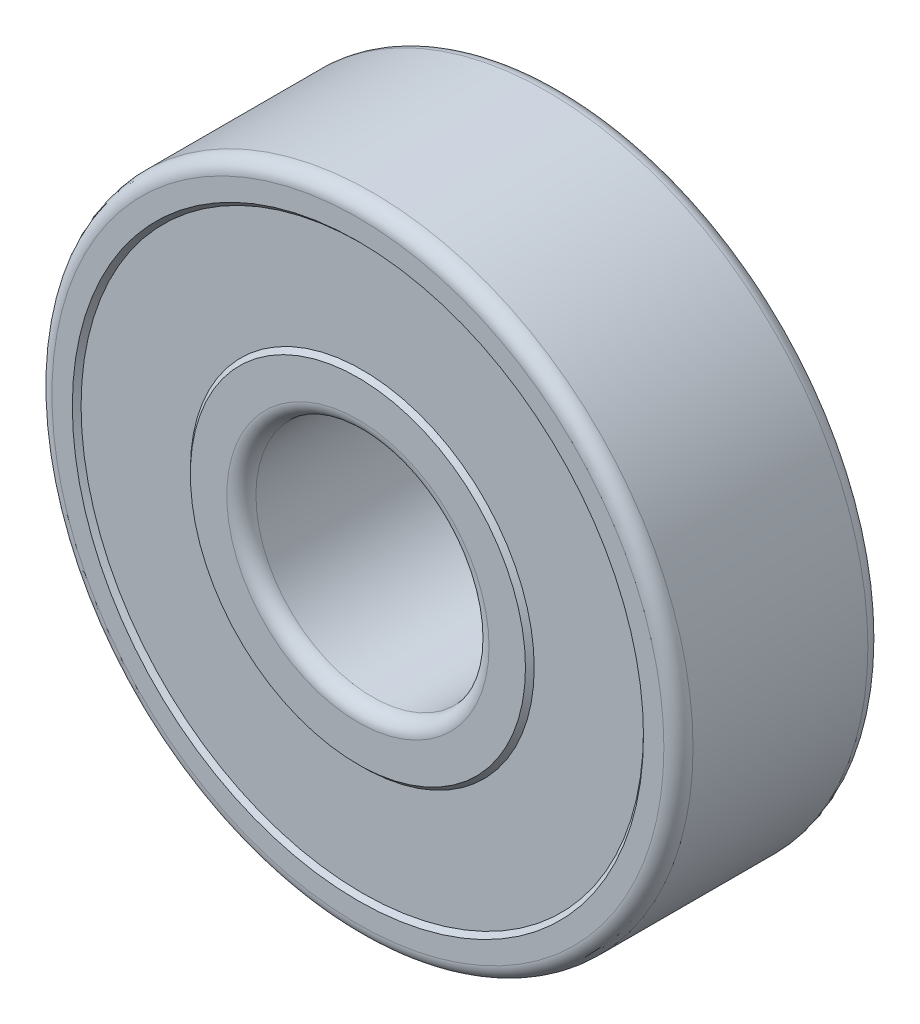
ISO-10303-21;
HEADER;
FILE_DESCRIPTION(('STEP AP214'),'2;1');
FILE_NAME('part.step','',(''),(''),'','','');
FILE_SCHEMA(('AUTOMOTIVE_DESIGN { 1 0 10303 214 1 1 1 1 }'));
ENDSEC;
DATA;
#1=APPLICATION_CONTEXT('core data for automotive mechanical design processes');
#2=APPLICATION_PROTOCOL_DEFINITION('international standard','automotive_design',2000,#1);
#3=PRODUCT_CONTEXT('',#1,'mechanical');
#4=PRODUCT('Part','Part','',(#3));
#5=PRODUCT_RELATED_PRODUCT_CATEGORY('part','',(#4));
#6=PRODUCT_DEFINITION_FORMATION('','',#4);
#7=PRODUCT_DEFINITION_CONTEXT('part definition',#1,'design');
#8=PRODUCT_DEFINITION('design','',#6,#7);
#9=PRODUCT_DEFINITION_SHAPE('','',#8);
#10=(LENGTH_UNIT() NAMED_UNIT(*) SI_UNIT(.MILLI.,.METRE.));
#11=(NAMED_UNIT(*) PLANE_ANGLE_UNIT() SI_UNIT($,.RADIAN.));
#12=(NAMED_UNIT(*) SI_UNIT($,.STERADIAN.) SOLID_ANGLE_UNIT());
#13=UNCERTAINTY_MEASURE_WITH_UNIT(LENGTH_MEASURE(1.E-05),#10,'distance_accuracy_value','');
#14=(GEOMETRIC_REPRESENTATION_CONTEXT(3) GLOBAL_UNCERTAINTY_ASSIGNED_CONTEXT((#13)) GLOBAL_UNIT_ASSIGNED_CONTEXT((#10,
#11,#12)) REPRESENTATION_CONTEXT('',''));
#15=CARTESIAN_POINT('',(0.,0.,0.));
#16=DIRECTION('',(0.,0.,1.));
#17=DIRECTION('',(1.,0.,0.));
#18=AXIS2_PLACEMENT_3D('',#15,#16,#17);
#19=CARTESIAN_POINT('',(0.,0.,-6.85));
#20=DIRECTION('',(0.,0.,1.));
#21=DIRECTION('',(1.,0.,0.));
#22=AXIS2_PLACEMENT_3D('',#19,#20,#21);
#23=CONICAL_SURFACE('',#22,5.9,0.7853981625);
#24=CARTESIAN_POINT('',(0.,0.,-6.85));
#25=DIRECTION('',(0.,0.,1.));
#26=DIRECTION('',(1.,0.,0.));
#27=AXIS2_PLACEMENT_3D('',#24,#25,#26);
#28=CIRCLE('',#27,5.9);
#29=CARTESIAN_POINT('',(5.9,0.,-6.85));
#30=VERTEX_POINT('',#29);
#31=EDGE_CURVE('P0_E80',#30,#30,#28,.T.);
#32=ORIENTED_EDGE('',*,*,#31,.F.);
#33=EDGE_LOOP('',(#32));
#34=FACE_BOUND('',#33,.T.);
#35=CARTESIAN_POINT('',(0.,0.,-7.));
#36=DIRECTION('',(0.,0.,-1.));
#37=DIRECTION('',(1.,0.,0.));
#38=AXIS2_PLACEMENT_3D('',#35,#36,#37);
#39=CIRCLE('',#38,5.75);
#40=CARTESIAN_POINT('',(5.75,0.,-7.));
#41=VERTEX_POINT('',#40);
#42=EDGE_CURVE('P0_E68',#41,#41,#39,.T.);
#43=ORIENTED_EDGE('',*,*,#42,.F.);
#44=EDGE_LOOP('',(#43));
#45=FACE_BOUND('',#44,.T.);
#46=ADVANCED_FACE('P0_F16',(#34,#45),#23,.T.);
#47=CARTESIAN_POINT('',(0.,0.,0.));
#48=DIRECTION('',(0.,0.,-1.));
#49=DIRECTION('',(-1.,0.,0.));
#50=AXIS2_PLACEMENT_3D('',#47,#48,#49);
#51=CONICAL_SURFACE('',#50,5.75,0.7853981625);
#52=CARTESIAN_POINT('',(0.,0.,0.));
#53=DIRECTION('',(0.,0.,1.));
#54=DIRECTION('',(1.,0.,0.));
#55=AXIS2_PLACEMENT_3D('',#52,#53,#54);
#56=CIRCLE('',#55,5.75);
#57=CARTESIAN_POINT('',(5.75,0.,0.));
#58=VERTEX_POINT('',#57);
#59=EDGE_CURVE('P0_E27',#58,#58,#56,.T.);
#60=ORIENTED_EDGE('',*,*,#59,.F.);
#61=EDGE_LOOP('',(#60));
#62=FACE_BOUND('',#61,.T.);
#63=CARTESIAN_POINT('',(0.,0.,-0.15));
#64=DIRECTION('',(0.,0.,-1.));
#65=DIRECTION('',(1.,0.,0.));
#66=AXIS2_PLACEMENT_3D('',#63,#64,#65);
#67=CIRCLE('',#66,5.9);
#68=CARTESIAN_POINT('',(5.9,0.,-0.15));
#69=VERTEX_POINT('',#68);
#70=EDGE_CURVE('P0_E89',#69,#69,#67,.T.);
#71=ORIENTED_EDGE('',*,*,#70,.F.);
#72=EDGE_LOOP('',(#71));
#73=FACE_BOUND('',#72,.T.);
#74=ADVANCED_FACE('P0_F113',(#62,#73),#51,.T.);
#75=CARTESIAN_POINT('',(0.,0.,-6.5));
#76=DIRECTION('',(0.,0.,1.));
#77=DIRECTION('',(1.,0.,0.));
#78=AXIS2_PLACEMENT_3D('',#75,#76,#77);
#79=TOROIDAL_SURFACE('',#78,4.5,0.5);
#80=CARTESIAN_POINT('',(0.,0.,-7.));
#81=DIRECTION('',(0.,0.,1.));
#82=DIRECTION('',(1.,0.,0.));
#83=AXIS2_PLACEMENT_3D('',#80,#81,#82);
#84=CIRCLE('',#83,4.5);
#85=CARTESIAN_POINT('',(4.5,0.,-7.));
#86=VERTEX_POINT('',#85);
#87=EDGE_CURVE('P0_E63',#86,#86,#84,.T.);
#88=ORIENTED_EDGE('',*,*,#87,.F.);
#89=EDGE_LOOP('',(#88));
#90=FACE_BOUND('',#89,.T.);
#91=CARTESIAN_POINT('',(0.,0.,-6.5));
#92=DIRECTION('',(0.,0.,-1.));
#93=DIRECTION('',(1.,0.,0.));
#94=AXIS2_PLACEMENT_3D('',#91,#92,#93);
#95=CIRCLE('',#94,4.);
#96=CARTESIAN_POINT('',(4.,0.,-6.5));
#97=VERTEX_POINT('',#96);
#98=EDGE_CURVE('P0_E75',#97,#97,#95,.T.);
#99=ORIENTED_EDGE('',*,*,#98,.F.);
#100=EDGE_LOOP('',(#99));
#101=FACE_BOUND('',#100,.T.);
#102=ADVANCED_FACE('P0_F110',(#90,#101),#79,.T.);
#103=CARTESIAN_POINT('',(0.,0.,-0.5));
#104=DIRECTION('',(0.,0.,1.));
#105=DIRECTION('',(1.,0.,0.));
#106=AXIS2_PLACEMENT_3D('',#103,#104,#105);
#107=TOROIDAL_SURFACE('',#106,4.5,0.5);
#108=CARTESIAN_POINT('',(0.,0.,-0.5));
#109=DIRECTION('',(0.,0.,1.));
#110=DIRECTION('',(1.,0.,0.));
#111=AXIS2_PLACEMENT_3D('',#108,#109,#110);
#112=CIRCLE('',#111,4.);
#113=CARTESIAN_POINT('',(4.,0.,-0.5));
#114=VERTEX_POINT('',#113);
#115=EDGE_CURVE('P0_E87',#114,#114,#112,.T.);
#116=ORIENTED_EDGE('',*,*,#115,.F.);
#117=EDGE_LOOP('',(#116));
#118=FACE_BOUND('',#117,.T.);
#119=CARTESIAN_POINT('',(0.,0.,0.));
#120=DIRECTION('',(0.,0.,-1.));
#121=DIRECTION('',(1.,0.,0.));
#122=AXIS2_PLACEMENT_3D('',#119,#120,#121);
#123=CIRCLE('',#122,4.5);
#124=CARTESIAN_POINT('',(4.5,0.,0.));
#125=VERTEX_POINT('',#124);
#126=EDGE_CURVE('P0_E10',#125,#125,#123,.T.);
#127=ORIENTED_EDGE('',*,*,#126,.F.);
#128=EDGE_LOOP('',(#127));
#129=FACE_BOUND('',#128,.T.);
#130=ADVANCED_FACE('P0_F112',(#118,#129),#107,.T.);
#131=CARTESIAN_POINT('',(0.,0.,-3.5));
#132=DIRECTION('',(0.,0.,1.));
#133=DIRECTION('',(1.,0.,0.));
#134=AXIS2_PLACEMENT_3D('',#131,#132,#133);
#135=TOROIDAL_SURFACE('',#134,7.5,2.);
#136=CARTESIAN_POINT('',(0.,0.,-4.7));
#137=DIRECTION('',(0.,0.,1.));
#138=DIRECTION('',(1.,0.,0.));
#139=AXIS2_PLACEMENT_3D('',#136,#137,#138);
#140=CIRCLE('',#139,5.9);
#141=CARTESIAN_POINT('',(5.9,0.,-4.7));
#142=VERTEX_POINT('',#141);
#143=EDGE_CURVE('P0_E78',#142,#142,#140,.T.);
#144=ORIENTED_EDGE('',*,*,#143,.T.);
#145=EDGE_LOOP('',(#144));
#146=FACE_BOUND('',#145,.T.);
#147=CARTESIAN_POINT('',(0.,0.,-2.3));
#148=DIRECTION('',(0.,0.,-1.));
#149=DIRECTION('',(-1.,0.,0.));
#150=AXIS2_PLACEMENT_3D('',#147,#148,#149);
#151=CIRCLE('',#150,5.9);
#152=CARTESIAN_POINT('',(-5.9,0.,-2.3));
#153=VERTEX_POINT('',#152);
#154=EDGE_CURVE('P0_E20',#153,#153,#151,.T.);
#155=ORIENTED_EDGE('',*,*,#154,.T.);
#156=EDGE_LOOP('',(#155));
#157=FACE_BOUND('',#156,.T.);
#158=ADVANCED_FACE('P0_F120',(#146,#157),#135,.F.);
#159=CARTESIAN_POINT('',(0.,0.,0.));
#160=DIRECTION('',(0.,0.,1.));
#161=DIRECTION('',(1.,0.,0.));
#162=AXIS2_PLACEMENT_3D('',#159,#160,#161);
#163=PLANE('',#162);
#164=ORIENTED_EDGE('',*,*,#126,.T.);
#165=EDGE_LOOP('',(#164));
#166=FACE_BOUND('',#165,.T.);
#167=ORIENTED_EDGE('',*,*,#59,.T.);
#168=EDGE_LOOP('',(#167));
#169=FACE_BOUND('',#168,.T.);
#170=ADVANCED_FACE('P0_F134',(#166,#169),#163,.T.);
#171=CARTESIAN_POINT('',(0.,0.,-7.));
#172=DIRECTION('',(0.,0.,1.));
#173=DIRECTION('',(1.,0.,0.));
#174=AXIS2_PLACEMENT_3D('',#171,#172,#173);
#175=PLANE('',#174);
#176=ORIENTED_EDGE('',*,*,#87,.T.);
#177=EDGE_LOOP('',(#176));
#178=FACE_BOUND('',#177,.T.);
#179=ORIENTED_EDGE('',*,*,#42,.T.);
#180=EDGE_LOOP('',(#179));
#181=FACE_BOUND('',#180,.T.);
#182=ADVANCED_FACE('P0_F64',(#178,#181),#175,.F.);
#183=CARTESIAN_POINT('',(0.,0.,-7.));
#184=DIRECTION('',(0.,0.,1.));
#185=DIRECTION('',(1.,0.,0.));
#186=AXIS2_PLACEMENT_3D('',#183,#184,#185);
#187=CYLINDRICAL_SURFACE('',#186,4.);
#188=ORIENTED_EDGE('',*,*,#98,.T.);
#189=EDGE_LOOP('',(#188));
#190=FACE_BOUND('',#189,.T.);
#191=ORIENTED_EDGE('',*,*,#115,.T.);
#192=EDGE_LOOP('',(#191));
#193=FACE_BOUND('',#192,.T.);
#194=ADVANCED_FACE('P0_F18',(#190,#193),#187,.F.);
#195=CARTESIAN_POINT('',(0.,0.,-7.));
#196=DIRECTION('',(0.,0.,1.));
#197=DIRECTION('',(1.,0.,0.));
#198=AXIS2_PLACEMENT_3D('',#195,#196,#197);
#199=CYLINDRICAL_SURFACE('',#198,5.9);
#200=ORIENTED_EDGE('',*,*,#143,.F.);
#201=EDGE_LOOP('',(#200));
#202=FACE_BOUND('',#201,.T.);
#203=ORIENTED_EDGE('',*,*,#31,.T.);
#204=EDGE_LOOP('',(#203));
#205=FACE_BOUND('',#204,.T.);
#206=ADVANCED_FACE('P0_F141',(#202,#205),#199,.T.);
#207=CARTESIAN_POINT('',(0.,0.,-7.));
#208=DIRECTION('',(0.,0.,1.));
#209=DIRECTION('',(1.,0.,0.));
#210=AXIS2_PLACEMENT_3D('',#207,#208,#209);
#211=CYLINDRICAL_SURFACE('',#210,5.9);
#212=ORIENTED_EDGE('',*,*,#154,.F.);
#213=EDGE_LOOP('',(#212));
#214=FACE_BOUND('',#213,.T.);
#215=ORIENTED_EDGE('',*,*,#70,.T.);
#216=EDGE_LOOP('',(#215));
#217=FACE_BOUND('',#216,.T.);
#218=ADVANCED_FACE('P0_F138',(#214,#217),#211,.T.);
#219=CLOSED_SHELL('',(#46,#74,#102,#130,#158,#170,#182,#194,#206,#218));
#220=MANIFOLD_SOLID_BREP('P0_B1',#219);
#221=CARTESIAN_POINT('',(0.,0.,-0.15));
#222=DIRECTION('',(0.,0.,1.));
#223=DIRECTION('',(1.,0.,0.));
#224=AXIS2_PLACEMENT_3D('',#221,#222,#223);
#225=CONICAL_SURFACE('',#224,9.65,0.785398162499996);
#226=CARTESIAN_POINT('',(0.,0.,-0.15));
#227=DIRECTION('',(0.,0.,1.));
#228=DIRECTION('',(1.,0.,0.));
#229=AXIS2_PLACEMENT_3D('',#226,#227,#228);
#230=CIRCLE('',#229,9.65);
#231=CARTESIAN_POINT('',(9.65,0.,-0.15));
#232=VERTEX_POINT('',#231);
#233=EDGE_CURVE('P1_E21',#232,#232,#230,.T.);
#234=ORIENTED_EDGE('',*,*,#233,.F.);
#235=EDGE_LOOP('',(#234));
#236=FACE_BOUND('',#235,.T.);
#237=CARTESIAN_POINT('',(0.,0.,0.));
#238=DIRECTION('',(0.,0.,-1.));
#239=DIRECTION('',(1.,0.,0.));
#240=AXIS2_PLACEMENT_3D('',#237,#238,#239);
#241=CIRCLE('',#240,9.8);
#242=CARTESIAN_POINT('',(9.8,0.,0.));
#243=VERTEX_POINT('',#242);
#244=EDGE_CURVE('P1_E83',#243,#243,#241,.T.);
#245=ORIENTED_EDGE('',*,*,#244,.F.);
#246=EDGE_LOOP('',(#245));
#247=FACE_BOUND('',#246,.T.);
#248=ADVANCED_FACE('P1_F17',(#236,#247),#225,.F.);
#249=CARTESIAN_POINT('',(0.,0.,-7.));
#250=DIRECTION('',(0.,0.,-1.));
#251=DIRECTION('',(-1.,0.,0.));
#252=AXIS2_PLACEMENT_3D('',#249,#250,#251);
#253=CONICAL_SURFACE('',#252,9.8,0.785398162500003);
#254=CARTESIAN_POINT('',(0.,0.,-7.));
#255=DIRECTION('',(0.,0.,1.));
#256=DIRECTION('',(1.,0.,0.));
#257=AXIS2_PLACEMENT_3D('',#254,#255,#256);
#258=CIRCLE('',#257,9.8);
#259=CARTESIAN_POINT('',(9.8,0.,-7.));
#260=VERTEX_POINT('',#259);
#261=EDGE_CURVE('P1_E77',#260,#260,#258,.T.);
#262=ORIENTED_EDGE('',*,*,#261,.F.);
#263=EDGE_LOOP('',(#262));
#264=FACE_BOUND('',#263,.T.);
#265=CARTESIAN_POINT('',(0.,0.,-6.85));
#266=DIRECTION('',(0.,0.,-1.));
#267=DIRECTION('',(1.,0.,0.));
#268=AXIS2_PLACEMENT_3D('',#265,#266,#267);
#269=CIRCLE('',#268,9.65);
#270=CARTESIAN_POINT('',(9.65,0.,-6.85));
#271=VERTEX_POINT('',#270);
#272=EDGE_CURVE('P1_E100',#271,#271,#269,.T.);
#273=ORIENTED_EDGE('',*,*,#272,.F.);
#274=EDGE_LOOP('',(#273));
#275=FACE_BOUND('',#274,.T.);
#276=ADVANCED_FACE('P1_F133',(#264,#275),#253,.F.);
#277=CARTESIAN_POINT('',(0.,0.,-1.));
#278=DIRECTION('',(0.,0.,1.));
#279=DIRECTION('',(1.,0.,0.));
#280=AXIS2_PLACEMENT_3D('',#277,#278,#279);
#281=PLANE('',#280);
#282=CARTESIAN_POINT('',(0.,0.,-1.));
#283=DIRECTION('',(0.,0.,1.));
#284=DIRECTION('',(1.,0.,0.));
#285=AXIS2_PLACEMENT_3D('',#282,#283,#284);
#286=CIRCLE('',#285,9.1);
#287=CARTESIAN_POINT('',(9.1,0.,-1.));
#288=VERTEX_POINT('',#287);
#289=EDGE_CURVE('P1_E68',#288,#288,#286,.T.);
#290=ORIENTED_EDGE('',*,*,#289,.F.);
#291=EDGE_LOOP('',(#290));
#292=FACE_BOUND('',#291,.T.);
#293=CARTESIAN_POINT('',(0.,0.,-1.));
#294=DIRECTION('',(0.,0.,-1.));
#295=DIRECTION('',(1.,0.,0.));
#296=AXIS2_PLACEMENT_3D('',#293,#294,#295);
#297=CIRCLE('',#296,9.65);
#298=CARTESIAN_POINT('',(9.65,0.,-1.));
#299=VERTEX_POINT('',#298);
#300=EDGE_CURVE('P1_E11',#299,#299,#297,.T.);
#301=ORIENTED_EDGE('',*,*,#300,.F.);
#302=EDGE_LOOP('',(#301));
#303=FACE_BOUND('',#302,.T.);
#304=ADVANCED_FACE('P1_F136',(#292,#303),#281,.T.);
#305=CARTESIAN_POINT('',(0.,0.,-1.));
#306=DIRECTION('',(0.,0.,1.));
#307=DIRECTION('',(1.,0.,0.));
#308=AXIS2_PLACEMENT_3D('',#305,#306,#307);
#309=CYLINDRICAL_SURFACE('',#308,9.65);
#310=ORIENTED_EDGE('',*,*,#300,.T.);
#311=EDGE_LOOP('',(#310));
#312=FACE_BOUND('',#311,.T.);
#313=ORIENTED_EDGE('',*,*,#233,.T.);
#314=EDGE_LOOP('',(#313));
#315=FACE_BOUND('',#314,.T.);
#316=ADVANCED_FACE('P1_F150',(#312,#315),#309,.F.);
#317=CARTESIAN_POINT('',(0.,0.,-6.));
#318=DIRECTION('',(0.,0.,1.));
#319=DIRECTION('',(1.,0.,0.));
#320=AXIS2_PLACEMENT_3D('',#317,#318,#319);
#321=PLANE('',#320);
#322=CARTESIAN_POINT('',(0.,0.,-6.));
#323=DIRECTION('',(0.,0.,1.));
#324=DIRECTION('',(1.,0.,0.));
#325=AXIS2_PLACEMENT_3D('',#322,#323,#324);
#326=CIRCLE('',#325,9.1);
#327=CARTESIAN_POINT('',(9.1,0.,-6.));
#328=VERTEX_POINT('',#327);
#329=EDGE_CURVE('P1_E92',#328,#328,#326,.T.);
#330=ORIENTED_EDGE('',*,*,#329,.T.);
#331=EDGE_LOOP('',(#330));
#332=FACE_BOUND('',#331,.T.);
#333=CARTESIAN_POINT('',(0.,0.,-6.));
#334=DIRECTION('',(0.,0.,-1.));
#335=DIRECTION('',(1.,0.,0.));
#336=AXIS2_PLACEMENT_3D('',#333,#334,#335);
#337=CIRCLE('',#336,9.65);
#338=CARTESIAN_POINT('',(9.65,0.,-6.));
#339=VERTEX_POINT('',#338);
#340=EDGE_CURVE('P1_E96',#339,#339,#337,.T.);
#341=ORIENTED_EDGE('',*,*,#340,.T.);
#342=EDGE_LOOP('',(#341));
#343=FACE_BOUND('',#342,.T.);
#344=ADVANCED_FACE('P1_F144',(#332,#343),#321,.F.);
#345=CARTESIAN_POINT('',(0.,0.,-6.));
#346=DIRECTION('',(0.,0.,-1.));
#347=DIRECTION('',(-1.,0.,0.));
#348=AXIS2_PLACEMENT_3D('',#345,#346,#347);
#349=CYLINDRICAL_SURFACE('',#348,9.65);
#350=ORIENTED_EDGE('',*,*,#340,.F.);
#351=EDGE_LOOP('',(#350));
#352=FACE_BOUND('',#351,.T.);
#353=ORIENTED_EDGE('',*,*,#272,.T.);
#354=EDGE_LOOP('',(#353));
#355=FACE_BOUND('',#354,.T.);
#356=ADVANCED_FACE('P1_F19',(#352,#355),#349,.F.);
#357=CARTESIAN_POINT('',(0.,0.,-6.5));
#358=DIRECTION('',(0.,0.,1.));
#359=DIRECTION('',(1.,0.,0.));
#360=AXIS2_PLACEMENT_3D('',#357,#358,#359);
#361=TOROIDAL_SURFACE('',#360,10.5,0.5);
#362=CARTESIAN_POINT('',(0.,0.,-6.5));
#363=DIRECTION('',(0.,0.,1.));
#364=DIRECTION('',(1.,0.,0.));
#365=AXIS2_PLACEMENT_3D('',#362,#363,#364);
#366=CIRCLE('',#365,11.);
#367=CARTESIAN_POINT('',(11.,0.,-6.5));
#368=VERTEX_POINT('',#367);
#369=EDGE_CURVE('P1_E80',#368,#368,#366,.T.);
#370=ORIENTED_EDGE('',*,*,#369,.F.);
#371=EDGE_LOOP('',(#370));
#372=FACE_BOUND('',#371,.T.);
#373=CARTESIAN_POINT('',(0.,0.,-7.));
#374=DIRECTION('',(0.,0.,-1.));
#375=DIRECTION('',(1.,0.,0.));
#376=AXIS2_PLACEMENT_3D('',#373,#374,#375);
#377=CIRCLE('',#376,10.5);
#378=CARTESIAN_POINT('',(10.5,0.,-7.));
#379=VERTEX_POINT('',#378);
#380=EDGE_CURVE('P1_E86',#379,#379,#377,.T.);
#381=ORIENTED_EDGE('',*,*,#380,.F.);
#382=EDGE_LOOP('',(#381));
#383=FACE_BOUND('',#382,.T.);
#384=ADVANCED_FACE('P1_F118',(#372,#383),#361,.T.);
#385=CARTESIAN_POINT('',(0.,0.,-0.5));
#386=DIRECTION('',(0.,0.,1.));
#387=DIRECTION('',(1.,0.,0.));
#388=AXIS2_PLACEMENT_3D('',#385,#386,#387);
#389=TOROIDAL_SURFACE('',#388,10.5,0.5);
#390=CARTESIAN_POINT('',(0.,0.,0.));
#391=DIRECTION('',(0.,0.,1.));
#392=DIRECTION('',(1.,0.,0.));
#393=AXIS2_PLACEMENT_3D('',#390,#391,#392);
#394=CIRCLE('',#393,10.5);
#395=CARTESIAN_POINT('',(10.5,0.,0.));
#396=VERTEX_POINT('',#395);
#397=EDGE_CURVE('P1_E85',#396,#396,#394,.T.);
#398=ORIENTED_EDGE('',*,*,#397,.F.);
#399=EDGE_LOOP('',(#398));
#400=FACE_BOUND('',#399,.T.);
#401=CARTESIAN_POINT('',(0.,0.,-0.5));
#402=DIRECTION('',(0.,0.,-1.));
#403=DIRECTION('',(1.,0.,0.));
#404=AXIS2_PLACEMENT_3D('',#401,#402,#403);
#405=CIRCLE('',#404,11.);
#406=CARTESIAN_POINT('',(11.,0.,-0.5));
#407=VERTEX_POINT('',#406);
#408=EDGE_CURVE('P1_E72',#407,#407,#405,.T.);
#409=ORIENTED_EDGE('',*,*,#408,.F.);
#410=EDGE_LOOP('',(#409));
#411=FACE_BOUND('',#410,.T.);
#412=ADVANCED_FACE('P1_F121',(#400,#411),#389,.T.);
#413=CARTESIAN_POINT('',(0.,0.,-3.5));
#414=DIRECTION('',(0.,0.,-1.));
#415=DIRECTION('',(-1.,0.,0.));
#416=AXIS2_PLACEMENT_3D('',#413,#414,#415);
#417=TOROIDAL_SURFACE('',#416,7.5,2.);
#418=CARTESIAN_POINT('',(0.,0.,-4.7));
#419=DIRECTION('',(0.,0.,1.));
#420=DIRECTION('',(1.,0.,0.));
#421=AXIS2_PLACEMENT_3D('',#418,#419,#420);
#422=CIRCLE('',#421,9.1);
#423=CARTESIAN_POINT('',(9.1,0.,-4.7));
#424=VERTEX_POINT('',#423);
#425=EDGE_CURVE('P1_E88',#424,#424,#422,.T.);
#426=ORIENTED_EDGE('',*,*,#425,.F.);
#427=EDGE_LOOP('',(#426));
#428=FACE_BOUND('',#427,.T.);
#429=CARTESIAN_POINT('',(0.,0.,-2.3));
#430=DIRECTION('',(0.,0.,-1.));
#431=DIRECTION('',(-1.,0.,0.));
#432=AXIS2_PLACEMENT_3D('',#429,#430,#431);
#433=CIRCLE('',#432,9.1);
#434=CARTESIAN_POINT('',(-9.1,0.,-2.3));
#435=VERTEX_POINT('',#434);
#436=EDGE_CURVE('P1_E61',#435,#435,#433,.T.);
#437=ORIENTED_EDGE('',*,*,#436,.F.);
#438=EDGE_LOOP('',(#437));
#439=FACE_BOUND('',#438,.T.);
#440=ADVANCED_FACE('P1_F170',(#428,#439),#417,.F.);
#441=CARTESIAN_POINT('',(0.,0.,0.));
#442=DIRECTION('',(0.,0.,1.));
#443=DIRECTION('',(1.,0.,0.));
#444=AXIS2_PLACEMENT_3D('',#441,#442,#443);
#445=PLANE('',#444);
#446=ORIENTED_EDGE('',*,*,#397,.T.);
#447=EDGE_LOOP('',(#446));
#448=FACE_BOUND('',#447,.T.);
#449=ORIENTED_EDGE('',*,*,#244,.T.);
#450=EDGE_LOOP('',(#449));
#451=FACE_BOUND('',#450,.T.);
#452=ADVANCED_FACE('P1_F129',(#448,#451),#445,.T.);
#453=CARTESIAN_POINT('',(0.,0.,-7.));
#454=DIRECTION('',(0.,0.,1.));
#455=DIRECTION('',(1.,0.,0.));
#456=AXIS2_PLACEMENT_3D('',#453,#454,#455);
#457=PLANE('',#456);
#458=ORIENTED_EDGE('',*,*,#380,.T.);
#459=EDGE_LOOP('',(#458));
#460=FACE_BOUND('',#459,.T.);
#461=ORIENTED_EDGE('',*,*,#261,.T.);
#462=EDGE_LOOP('',(#461));
#463=FACE_BOUND('',#462,.T.);
#464=ADVANCED_FACE('P1_F126',(#460,#463),#457,.F.);
#465=CARTESIAN_POINT('',(0.,0.,-7.));
#466=DIRECTION('',(0.,0.,1.));
#467=DIRECTION('',(1.,0.,0.));
#468=AXIS2_PLACEMENT_3D('',#465,#466,#467);
#469=CYLINDRICAL_SURFACE('',#468,9.1);
#470=ORIENTED_EDGE('',*,*,#436,.T.);
#471=EDGE_LOOP('',(#470));
#472=FACE_BOUND('',#471,.T.);
#473=ORIENTED_EDGE('',*,*,#289,.T.);
#474=EDGE_LOOP('',(#473));
#475=FACE_BOUND('',#474,.T.);
#476=ADVANCED_FACE('P1_F69',(#472,#475),#469,.F.);
#477=CARTESIAN_POINT('',(0.,0.,-7.));
#478=DIRECTION('',(0.,0.,1.));
#479=DIRECTION('',(1.,0.,0.));
#480=AXIS2_PLACEMENT_3D('',#477,#478,#479);
#481=CYLINDRICAL_SURFACE('',#480,11.);
#482=ORIENTED_EDGE('',*,*,#408,.T.);
#483=EDGE_LOOP('',(#482));
#484=FACE_BOUND('',#483,.T.);
#485=ORIENTED_EDGE('',*,*,#369,.T.);
#486=EDGE_LOOP('',(#485));
#487=FACE_BOUND('',#486,.T.);
#488=ADVANCED_FACE('P1_F116',(#484,#487),#481,.T.);
#489=CARTESIAN_POINT('',(0.,0.,-7.));
#490=DIRECTION('',(0.,0.,1.));
#491=DIRECTION('',(1.,0.,0.));
#492=AXIS2_PLACEMENT_3D('',#489,#490,#491);
#493=CYLINDRICAL_SURFACE('',#492,9.1);
#494=ORIENTED_EDGE('',*,*,#329,.F.);
#495=EDGE_LOOP('',(#494));
#496=FACE_BOUND('',#495,.T.);
#497=ORIENTED_EDGE('',*,*,#425,.T.);
#498=EDGE_LOOP('',(#497));
#499=FACE_BOUND('',#498,.T.);
#500=ADVANCED_FACE('P1_F162',(#496,#499),#493,.F.);
#501=CLOSED_SHELL('',(#248,#276,#304,#316,#344,#356,#384,#412,#440,#452,#464,#476,#488,#500));
#502=MANIFOLD_SOLID_BREP('P1_B1',#501);
#503=CARTESIAN_POINT('',(0.,7.5,-3.5));
#504=DIRECTION('',(0.,0.,1.));
#505=DIRECTION('',(1.,0.,0.));
#506=AXIS2_PLACEMENT_3D('',#503,#504,#505);
#507=SPHERICAL_SURFACE('',#506,2.);
#508=CARTESIAN_POINT('',(2.,7.5,-3.5));
#509=VERTEX_POINT('',#508);
#510=VERTEX_LOOP('',#509);
#511=FACE_BOUND('',#510,.T.);
#512=ADVANCED_FACE('P2_F15',(#511),#507,.T.);
#513=CLOSED_SHELL('',(#512));
#514=MANIFOLD_SOLID_BREP('P2_B1',#513);
#515=CARTESIAN_POINT('',(-5.86385270900786,4.67602731034167,-3.5));
#516=DIRECTION('',(0.,0.,1.));
#517=DIRECTION('',(0.623470308045556,0.781847027867715,0.));
#518=AXIS2_PLACEMENT_3D('',#515,#516,#517);
#519=SPHERICAL_SURFACE('',#518,2.);
#520=CARTESIAN_POINT('',(-4.61691209291675,6.2397213660771,-3.5));
#521=VERTEX_POINT('',#520);
#522=VERTEX_LOOP('',#521);
#523=FACE_BOUND('',#522,.T.);
#524=ADVANCED_FACE('P3_F15',(#523),#519,.T.);
#525=CLOSED_SHELL('',(#524));
#526=MANIFOLD_SOLID_BREP('P3_B1',#525);
#527=CARTESIAN_POINT('',(-7.3118761096378,-1.66927162478369,-3.5));
#528=DIRECTION('',(0.,0.,1.));
#529=DIRECTION('',(-0.222569549971159,0.974916814618373,0.));
#530=AXIS2_PLACEMENT_3D('',#527,#528,#529);
#531=SPHERICAL_SURFACE('',#530,2.);
#532=CARTESIAN_POINT('',(-7.75701520958012,0.280562004453052,-3.5));
#533=VERTEX_POINT('',#532);
#534=VERTEX_LOOP('',#533);
#535=FACE_BOUND('',#534,.T.);
#536=ADVANCED_FACE('P4_F15',(#535),#531,.T.);
#537=CLOSED_SHELL('',(#536));
#538=MANIFOLD_SOLID_BREP('P4_B1',#537);
#539=CARTESIAN_POINT('',(-3.25362259192578,-6.75750989857286,-3.5));
#540=DIRECTION('',(0.,0.,1.));
#541=DIRECTION('',(-0.901001319809715,0.433816345590103,0.));
#542=AXIS2_PLACEMENT_3D('',#539,#540,#541);
#543=SPHERICAL_SURFACE('',#542,2.);
#544=CARTESIAN_POINT('',(-5.05562523154521,-5.88987720739265,-3.5));
#545=VERTEX_POINT('',#544);
#546=VERTEX_LOOP('',#545);
#547=FACE_BOUND('',#546,.T.);
#548=ADVANCED_FACE('P5_F15',(#547),#543,.T.);
#549=CLOSED_SHELL('',(#548));
#550=MANIFOLD_SOLID_BREP('P5_B1',#549);
#551=CARTESIAN_POINT('',(3.25480195033391,-6.75694193138453,-3.5));
#552=DIRECTION('',(0.,0.,1.));
#553=DIRECTION('',(-0.900925590851271,-0.433973593377855,0.));
#554=AXIS2_PLACEMENT_3D('',#551,#552,#553);
#555=SPHERICAL_SURFACE('',#554,2.);
#556=CARTESIAN_POINT('',(1.45295076863137,-7.62488911814024,-3.5));
#557=VERTEX_POINT('',#556);
#558=VERTEX_LOOP('',#557);
#559=FACE_BOUND('',#558,.T.);
#560=ADVANCED_FACE('P6_F15',(#559),#555,.T.);
#561=CLOSED_SHELL('',(#560));
#562=MANIFOLD_SOLID_BREP('P6_B1',#561);
#563=CARTESIAN_POINT('',(7.3121673411297,-1.66799543623964,-3.5));
#564=DIRECTION('',(0.,0.,1.));
#565=DIRECTION('',(-0.222399391498618,-0.97495564548396,0.));
#566=AXIS2_PLACEMENT_3D('',#563,#564,#565);
#567=SPHERICAL_SURFACE('',#566,2.);
#568=CARTESIAN_POINT('',(6.86736855813246,-3.61790672720756,-3.5));
#569=VERTEX_POINT('',#568);
#570=VERTEX_LOOP('',#569);
#571=FACE_BOUND('',#570,.T.);
#572=ADVANCED_FACE('P7_F15',(#571),#567,.T.);
#573=CLOSED_SHELL('',(#572));
#574=MANIFOLD_SOLID_BREP('P7_B1',#573);
#575=CARTESIAN_POINT('',(5.86303649897566,4.67705067448272,-3.5));
#576=DIRECTION('',(0.,0.,1.));
#577=DIRECTION('',(0.623606756597696,-0.781738199863421,0.));
#578=AXIS2_PLACEMENT_3D('',#575,#576,#577);
#579=SPHERICAL_SURFACE('',#578,2.);
#580=CARTESIAN_POINT('',(7.11025001217105,3.11357427475588,-3.5));
#581=VERTEX_POINT('',#580);
#582=VERTEX_LOOP('',#581);
#583=FACE_BOUND('',#582,.T.);
#584=ADVANCED_FACE('P8_F15',(#583),#579,.T.);
#585=CLOSED_SHELL('',(#584));
#586=MANIFOLD_SOLID_BREP('P8_B1',#585);
#587=CARTESIAN_POINT('',(0.,0.,-6.85));
#588=DIRECTION('',(0.,0.,1.));
#589=DIRECTION('',(1.,0.,0.));
#590=AXIS2_PLACEMENT_3D('',#587,#588,#589);
#591=PLANE('',#590);
#592=CARTESIAN_POINT('',(0.,0.,-6.85));
#593=DIRECTION('',(0.,0.,1.));
#594=DIRECTION('',(1.,0.,0.));
#595=AXIS2_PLACEMENT_3D('',#592,#593,#594);
#596=CIRCLE('',#595,5.9);
#597=CARTESIAN_POINT('',(5.9,0.,-6.85));
#598=VERTEX_POINT('',#597);
#599=EDGE_CURVE('P9_E11',#598,#598,#596,.T.);
#600=ORIENTED_EDGE('',*,*,#599,.T.);
#601=EDGE_LOOP('',(#600));
#602=FACE_BOUND('',#601,.T.);
#603=CARTESIAN_POINT('',(0.,0.,-6.85));
#604=DIRECTION('',(0.,0.,1.));
#605=DIRECTION('',(1.,0.,0.));
#606=AXIS2_PLACEMENT_3D('',#603,#604,#605);
#607=CIRCLE('',#606,9.65);
#608=CARTESIAN_POINT('',(9.65,0.,-6.85));
#609=VERTEX_POINT('',#608);
#610=EDGE_CURVE('P9_E52',#609,#609,#607,.T.);
#611=ORIENTED_EDGE('',*,*,#610,.F.);
#612=EDGE_LOOP('',(#611));
#613=FACE_BOUND('',#612,.T.);
#614=ADVANCED_FACE('P9_F17',(#602,#613),#591,.F.);
#615=CARTESIAN_POINT('',(0.,0.,-6.));
#616=DIRECTION('',(0.,0.,1.));
#617=DIRECTION('',(1.,0.,0.));
#618=AXIS2_PLACEMENT_3D('',#615,#616,#617);
#619=PLANE('',#618);
#620=CARTESIAN_POINT('',(0.,0.,-6.));
#621=DIRECTION('',(0.,0.,1.));
#622=DIRECTION('',(1.,0.,0.));
#623=AXIS2_PLACEMENT_3D('',#620,#621,#622);
#624=CIRCLE('',#623,5.9);
#625=CARTESIAN_POINT('',(5.9,0.,-6.));
#626=VERTEX_POINT('',#625);
#627=EDGE_CURVE('P9_E28',#626,#626,#624,.T.);
#628=ORIENTED_EDGE('',*,*,#627,.F.);
#629=EDGE_LOOP('',(#628));
#630=FACE_BOUND('',#629,.T.);
#631=CARTESIAN_POINT('',(0.,0.,-6.));
#632=DIRECTION('',(0.,0.,1.));
#633=DIRECTION('',(1.,0.,0.));
#634=AXIS2_PLACEMENT_3D('',#631,#632,#633);
#635=CIRCLE('',#634,9.65);
#636=CARTESIAN_POINT('',(9.65,0.,-6.));
#637=VERTEX_POINT('',#636);
#638=EDGE_CURVE('P9_E21',#637,#637,#635,.T.);
#639=ORIENTED_EDGE('',*,*,#638,.T.);
#640=EDGE_LOOP('',(#639));
#641=FACE_BOUND('',#640,.T.);
#642=ADVANCED_FACE('P9_F65',(#630,#641),#619,.T.);
#643=CARTESIAN_POINT('',(0.,0.,-6.));
#644=DIRECTION('',(0.,0.,-1.));
#645=DIRECTION('',(-1.,0.,0.));
#646=AXIS2_PLACEMENT_3D('',#643,#644,#645);
#647=CYLINDRICAL_SURFACE('',#646,5.9);
#648=ORIENTED_EDGE('',*,*,#599,.F.);
#649=EDGE_LOOP('',(#648));
#650=FACE_BOUND('',#649,.T.);
#651=ORIENTED_EDGE('',*,*,#627,.T.);
#652=EDGE_LOOP('',(#651));
#653=FACE_BOUND('',#652,.T.);
#654=ADVANCED_FACE('P9_F70',(#650,#653),#647,.F.);
#655=CARTESIAN_POINT('',(0.,0.,-6.));
#656=DIRECTION('',(0.,0.,-1.));
#657=DIRECTION('',(-1.,0.,0.));
#658=AXIS2_PLACEMENT_3D('',#655,#656,#657);
#659=CYLINDRICAL_SURFACE('',#658,9.65);
#660=ORIENTED_EDGE('',*,*,#610,.T.);
#661=EDGE_LOOP('',(#660));
#662=FACE_BOUND('',#661,.T.);
#663=ORIENTED_EDGE('',*,*,#638,.F.);
#664=EDGE_LOOP('',(#663));
#665=FACE_BOUND('',#664,.T.);
#666=ADVANCED_FACE('P9_F19',(#662,#665),#659,.T.);
#667=CLOSED_SHELL('',(#614,#642,#654,#666));
#668=MANIFOLD_SOLID_BREP('P9_B1',#667);
#669=CARTESIAN_POINT('',(0.,0.,-0.15));
#670=DIRECTION('',(0.,0.,1.));
#671=DIRECTION('',(1.,0.,0.));
#672=AXIS2_PLACEMENT_3D('',#669,#670,#671);
#673=PLANE('',#672);
#674=CARTESIAN_POINT('',(0.,0.,-0.15));
#675=DIRECTION('',(0.,0.,1.));
#676=DIRECTION('',(1.,0.,0.));
#677=AXIS2_PLACEMENT_3D('',#674,#675,#676);
#678=CIRCLE('',#677,5.9);
#679=CARTESIAN_POINT('',(5.9,0.,-0.15));
#680=VERTEX_POINT('',#679);
#681=EDGE_CURVE('P10_E11',#680,#680,#678,.T.);
#682=ORIENTED_EDGE('',*,*,#681,.F.);
#683=EDGE_LOOP('',(#682));
#684=FACE_BOUND('',#683,.T.);
#685=CARTESIAN_POINT('',(0.,0.,-0.15));
#686=DIRECTION('',(0.,0.,1.));
#687=DIRECTION('',(1.,0.,0.));
#688=AXIS2_PLACEMENT_3D('',#685,#686,#687);
#689=CIRCLE('',#688,9.65);
#690=CARTESIAN_POINT('',(9.65,0.,-0.15));
#691=VERTEX_POINT('',#690);
#692=EDGE_CURVE('P10_E55',#691,#691,#689,.T.);
#693=ORIENTED_EDGE('',*,*,#692,.T.);
#694=EDGE_LOOP('',(#693));
#695=FACE_BOUND('',#694,.T.);
#696=ADVANCED_FACE('P10_F17',(#684,#695),#673,.T.);
#697=CARTESIAN_POINT('',(0.,0.,-1.));
#698=DIRECTION('',(0.,0.,1.));
#699=DIRECTION('',(1.,0.,0.));
#700=AXIS2_PLACEMENT_3D('',#697,#698,#699);
#701=PLANE('',#700);
#702=CARTESIAN_POINT('',(0.,0.,-1.));
#703=DIRECTION('',(0.,0.,1.));
#704=DIRECTION('',(1.,0.,0.));
#705=AXIS2_PLACEMENT_3D('',#702,#703,#704);
#706=CIRCLE('',#705,5.9);
#707=CARTESIAN_POINT('',(5.9,0.,-1.));
#708=VERTEX_POINT('',#707);
#709=EDGE_CURVE('P10_E26',#708,#708,#706,.T.);
#710=ORIENTED_EDGE('',*,*,#709,.T.);
#711=EDGE_LOOP('',(#710));
#712=FACE_BOUND('',#711,.T.);
#713=CARTESIAN_POINT('',(0.,0.,-1.));
#714=DIRECTION('',(0.,0.,1.));
#715=DIRECTION('',(1.,0.,0.));
#716=AXIS2_PLACEMENT_3D('',#713,#714,#715);
#717=CIRCLE('',#716,9.65);
#718=CARTESIAN_POINT('',(9.65,0.,-1.));
#719=VERTEX_POINT('',#718);
#720=EDGE_CURVE('P10_E51',#719,#719,#717,.T.);
#721=ORIENTED_EDGE('',*,*,#720,.F.);
#722=EDGE_LOOP('',(#721));
#723=FACE_BOUND('',#722,.T.);
#724=ADVANCED_FACE('P10_F19',(#712,#723),#701,.F.);
#725=CARTESIAN_POINT('',(0.,0.,-1.));
#726=DIRECTION('',(0.,0.,1.));
#727=DIRECTION('',(1.,0.,0.));
#728=AXIS2_PLACEMENT_3D('',#725,#726,#727);
#729=CYLINDRICAL_SURFACE('',#728,5.9);
#730=ORIENTED_EDGE('',*,*,#681,.T.);
#731=EDGE_LOOP('',(#730));
#732=FACE_BOUND('',#731,.T.);
#733=ORIENTED_EDGE('',*,*,#709,.F.);
#734=EDGE_LOOP('',(#733));
#735=FACE_BOUND('',#734,.T.);
#736=ADVANCED_FACE('P10_F78',(#732,#735),#729,.F.);
#737=CARTESIAN_POINT('',(0.,0.,-1.));
#738=DIRECTION('',(0.,0.,1.));
#739=DIRECTION('',(1.,0.,0.));
#740=AXIS2_PLACEMENT_3D('',#737,#738,#739);
#741=CYLINDRICAL_SURFACE('',#740,9.65);
#742=ORIENTED_EDGE('',*,*,#692,.F.);
#743=EDGE_LOOP('',(#742));
#744=FACE_BOUND('',#743,.T.);
#745=ORIENTED_EDGE('',*,*,#720,.T.);
#746=EDGE_LOOP('',(#745));
#747=FACE_BOUND('',#746,.T.);
#748=ADVANCED_FACE('P10_F52',(#744,#747),#741,.T.);
#749=CLOSED_SHELL('',(#696,#724,#736,#748));
#750=MANIFOLD_SOLID_BREP('P10_B1',#749);
#751=ADVANCED_BREP_SHAPE_REPRESENTATION('',(#18,#220,#502,#514,#526,#538,#550,#562,#574,#586,
#668,#750),#14);
#752=SHAPE_DEFINITION_REPRESENTATION(#9,#751);
ENDSEC;
END-ISO-10303-21;
